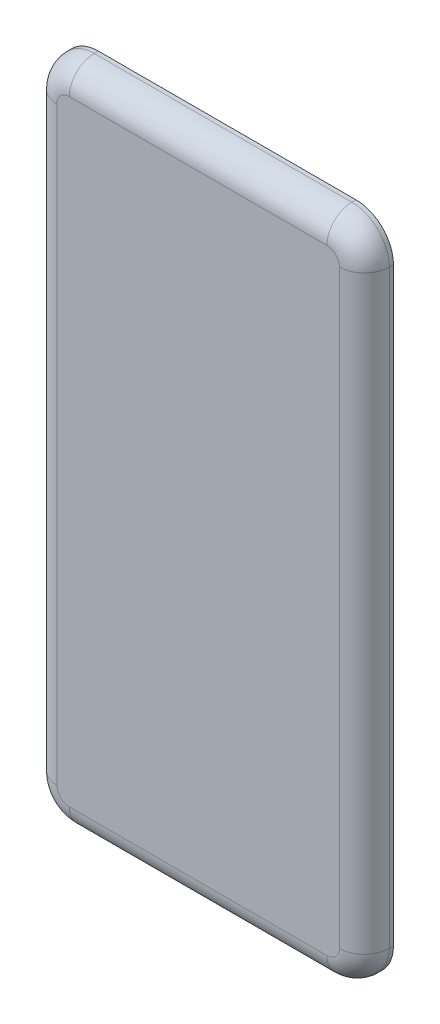
ISO-10303-21;
HEADER;
FILE_DESCRIPTION(('STEP AP214'),'2;1');
FILE_NAME('part.step','',(''),(''),'','','');
FILE_SCHEMA(('AUTOMOTIVE_DESIGN { 1 0 10303 214 1 1 1 1 }'));
ENDSEC;
DATA;
#1=APPLICATION_CONTEXT('core data for automotive mechanical design processes');
#2=APPLICATION_PROTOCOL_DEFINITION('international standard','automotive_design',2000,#1);
#3=PRODUCT_CONTEXT('',#1,'mechanical');
#4=PRODUCT('Part','Part','',(#3));
#5=PRODUCT_RELATED_PRODUCT_CATEGORY('part','',(#4));
#6=PRODUCT_DEFINITION_FORMATION('','',#4);
#7=PRODUCT_DEFINITION_CONTEXT('part definition',#1,'design');
#8=PRODUCT_DEFINITION('design','',#6,#7);
#9=PRODUCT_DEFINITION_SHAPE('','',#8);
#10=(LENGTH_UNIT() NAMED_UNIT(*) SI_UNIT(.MILLI.,.METRE.));
#11=(NAMED_UNIT(*) PLANE_ANGLE_UNIT() SI_UNIT($,.RADIAN.));
#12=(NAMED_UNIT(*) SI_UNIT($,.STERADIAN.) SOLID_ANGLE_UNIT());
#13=UNCERTAINTY_MEASURE_WITH_UNIT(LENGTH_MEASURE(1.E-05),#10,'distance_accuracy_value','');
#14=(GEOMETRIC_REPRESENTATION_CONTEXT(3) GLOBAL_UNCERTAINTY_ASSIGNED_CONTEXT((#13)) GLOBAL_UNIT_ASSIGNED_CONTEXT((#10,
#11,#12)) REPRESENTATION_CONTEXT('',''));
#15=CARTESIAN_POINT('',(0.,0.,0.));
#16=DIRECTION('',(0.,0.,1.));
#17=DIRECTION('',(1.,0.,0.));
#18=AXIS2_PLACEMENT_3D('',#15,#16,#17);
#19=CARTESIAN_POINT('',(88.1928839875572,0.,3.5));
#20=DIRECTION('',(0.,1.,0.));
#21=DIRECTION('',(0.,0.,1.));
#22=AXIS2_PLACEMENT_3D('',#19,#20,#21);
#23=PLANE('',#22);
#24=DIRECTION('',(0.,0.,-1.));
#25=VECTOR('',#24,1.);
#26=CARTESIAN_POINT('',(83.6928839875572,0.,3.5));
#27=LINE('',#26,#25);
#28=CARTESIAN_POINT('',(83.6928839875572,0.,0.));
#29=VERTEX_POINT('',#28);
#30=CARTESIAN_POINT('',(83.6928839875572,0.,0.5));
#31=VERTEX_POINT('',#30);
#32=EDGE_CURVE('E145',#29,#31,#27,.F.);
#33=ORIENTED_EDGE('',*,*,#32,.T.);
#34=DIRECTION('',(1.,0.,0.));
#35=VECTOR('',#34,1.);
#36=CARTESIAN_POINT('',(88.1928839875572,0.,0.5));
#37=LINE('',#36,#35);
#38=CARTESIAN_POINT('',(52.6928839875572,0.,0.5));
#39=VERTEX_POINT('',#38);
#40=EDGE_CURVE('E72',#31,#39,#37,.F.);
#41=ORIENTED_EDGE('',*,*,#40,.T.);
#42=DIRECTION('',(0.,0.,-1.));
#43=VECTOR('',#42,1.);
#44=CARTESIAN_POINT('',(52.6928839875572,0.,3.5));
#45=LINE('',#44,#43);
#46=CARTESIAN_POINT('',(52.6928839875572,0.,0.));
#47=VERTEX_POINT('',#46);
#48=EDGE_CURVE('E137',#39,#47,#45,.T.);
#49=ORIENTED_EDGE('',*,*,#48,.T.);
#50=DIRECTION('',(1.,0.,0.));
#51=VECTOR('',#50,1.);
#52=CARTESIAN_POINT('',(88.1928839875572,0.,0.));
#53=LINE('',#52,#51);
#54=EDGE_CURVE('E140',#47,#29,#53,.T.);
#55=ORIENTED_EDGE('',*,*,#54,.T.);
#56=EDGE_LOOP('',(#33,#41,#49,#55));
#57=FACE_BOUND('',#56,.T.);
#58=ADVANCED_FACE('F47',(#57),#23,.F.);
#59=CARTESIAN_POINT('',(88.1928839875572,80.,3.5));
#60=DIRECTION('',(-1.,0.,0.));
#61=DIRECTION('',(0.,0.,1.));
#62=AXIS2_PLACEMENT_3D('',#59,#60,#61);
#63=PLANE('',#62);
#64=DIRECTION('',(0.,0.,-1.));
#65=VECTOR('',#64,1.);
#66=CARTESIAN_POINT('',(88.1928839875572,75.5,3.5));
#67=LINE('',#66,#65);
#68=CARTESIAN_POINT('',(88.1928839875572,75.5,0.));
#69=VERTEX_POINT('',#68);
#70=CARTESIAN_POINT('',(88.1928839875572,75.5,0.5));
#71=VERTEX_POINT('',#70);
#72=EDGE_CURVE('E190',#69,#71,#67,.F.);
#73=ORIENTED_EDGE('',*,*,#72,.T.);
#74=DIRECTION('',(0.,1.,0.));
#75=VECTOR('',#74,1.);
#76=CARTESIAN_POINT('',(88.1928839875572,80.,0.5));
#77=LINE('',#76,#75);
#78=CARTESIAN_POINT('',(88.1928839875572,4.5,0.5));
#79=VERTEX_POINT('',#78);
#80=EDGE_CURVE('E239',#71,#79,#77,.F.);
#81=ORIENTED_EDGE('',*,*,#80,.T.);
#82=DIRECTION('',(0.,0.,-1.));
#83=VECTOR('',#82,1.);
#84=CARTESIAN_POINT('',(88.1928839875572,4.5,3.5));
#85=LINE('',#84,#83);
#86=CARTESIAN_POINT('',(88.1928839875572,4.5,0.));
#87=VERTEX_POINT('',#86);
#88=EDGE_CURVE('E194',#79,#87,#85,.T.);
#89=ORIENTED_EDGE('',*,*,#88,.T.);
#90=DIRECTION('',(0.,1.,0.));
#91=VECTOR('',#90,1.);
#92=CARTESIAN_POINT('',(88.1928839875572,80.,0.));
#93=LINE('',#92,#91);
#94=EDGE_CURVE('E161',#87,#69,#93,.T.);
#95=ORIENTED_EDGE('',*,*,#94,.T.);
#96=EDGE_LOOP('',(#73,#81,#89,#95));
#97=FACE_BOUND('',#96,.T.);
#98=ADVANCED_FACE('F327',(#97),#63,.F.);
#99=CARTESIAN_POINT('',(48.1928839875572,80.,3.5));
#100=DIRECTION('',(0.,-1.,0.));
#101=DIRECTION('',(0.,0.,-1.));
#102=AXIS2_PLACEMENT_3D('',#99,#100,#101);
#103=PLANE('',#102);
#104=DIRECTION('',(0.,0.,-1.));
#105=VECTOR('',#104,1.);
#106=CARTESIAN_POINT('',(52.6928839875572,80.,3.5));
#107=LINE('',#106,#105);
#108=CARTESIAN_POINT('',(52.6928839875572,80.,0.));
#109=VERTEX_POINT('',#108);
#110=CARTESIAN_POINT('',(52.6928839875572,80.,0.5));
#111=VERTEX_POINT('',#110);
#112=EDGE_CURVE('E200',#109,#111,#107,.F.);
#113=ORIENTED_EDGE('',*,*,#112,.T.);
#114=DIRECTION('',(-1.,0.,0.));
#115=VECTOR('',#114,1.);
#116=CARTESIAN_POINT('',(48.1928839875572,80.,0.5));
#117=LINE('',#116,#115);
#118=CARTESIAN_POINT('',(83.6928839875572,80.,0.5));
#119=VERTEX_POINT('',#118);
#120=EDGE_CURVE('E233',#111,#119,#117,.F.);
#121=ORIENTED_EDGE('',*,*,#120,.T.);
#122=DIRECTION('',(0.,0.,-1.));
#123=VECTOR('',#122,1.);
#124=CARTESIAN_POINT('',(83.6928839875572,80.,3.5));
#125=LINE('',#124,#123);
#126=CARTESIAN_POINT('',(83.6928839875572,80.,0.));
#127=VERTEX_POINT('',#126);
#128=EDGE_CURVE('E197',#119,#127,#125,.T.);
#129=ORIENTED_EDGE('',*,*,#128,.T.);
#130=DIRECTION('',(-1.,0.,0.));
#131=VECTOR('',#130,1.);
#132=CARTESIAN_POINT('',(48.1928839875572,80.,0.));
#133=LINE('',#132,#131);
#134=EDGE_CURVE('E166',#127,#109,#133,.T.);
#135=ORIENTED_EDGE('',*,*,#134,.T.);
#136=EDGE_LOOP('',(#113,#121,#129,#135));
#137=FACE_BOUND('',#136,.T.);
#138=ADVANCED_FACE('F312',(#137),#103,.F.);
#139=CARTESIAN_POINT('',(48.1928839875572,0.,3.5));
#140=DIRECTION('',(1.,0.,0.));
#141=DIRECTION('',(0.,0.,-1.));
#142=AXIS2_PLACEMENT_3D('',#139,#140,#141);
#143=PLANE('',#142);
#144=DIRECTION('',(0.,0.,-1.));
#145=VECTOR('',#144,1.);
#146=CARTESIAN_POINT('',(48.1928839875572,4.5,3.5));
#147=LINE('',#146,#145);
#148=CARTESIAN_POINT('',(48.1928839875572,4.5,0.));
#149=VERTEX_POINT('',#148);
#150=CARTESIAN_POINT('',(48.1928839875572,4.5,0.5));
#151=VERTEX_POINT('',#150);
#152=EDGE_CURVE('E149',#149,#151,#147,.F.);
#153=ORIENTED_EDGE('',*,*,#152,.T.);
#154=DIRECTION('',(0.,-1.,0.));
#155=VECTOR('',#154,1.);
#156=CARTESIAN_POINT('',(48.1928839875572,0.,0.5));
#157=LINE('',#156,#155);
#158=CARTESIAN_POINT('',(48.1928839875572,75.5,0.5));
#159=VERTEX_POINT('',#158);
#160=EDGE_CURVE('E11',#151,#159,#157,.F.);
#161=ORIENTED_EDGE('',*,*,#160,.T.);
#162=DIRECTION('',(0.,0.,-1.));
#163=VECTOR('',#162,1.);
#164=CARTESIAN_POINT('',(48.1928839875572,75.5,3.5));
#165=LINE('',#164,#163);
#166=CARTESIAN_POINT('',(48.1928839875572,75.5,0.));
#167=VERTEX_POINT('',#166);
#168=EDGE_CURVE('E154',#159,#167,#165,.T.);
#169=ORIENTED_EDGE('',*,*,#168,.T.);
#170=DIRECTION('',(0.,-1.,0.));
#171=VECTOR('',#170,1.);
#172=CARTESIAN_POINT('',(48.1928839875572,0.,0.));
#173=LINE('',#172,#171);
#174=EDGE_CURVE('E174',#167,#149,#173,.T.);
#175=ORIENTED_EDGE('',*,*,#174,.T.);
#176=EDGE_LOOP('',(#153,#161,#169,#175));
#177=FACE_BOUND('',#176,.T.);
#178=ADVANCED_FACE('F295',(#177),#143,.F.);
#179=CARTESIAN_POINT('',(0.,0.,3.5));
#180=DIRECTION('',(0.,0.,-1.));
#181=DIRECTION('',(-1.,0.,0.));
#182=AXIS2_PLACEMENT_3D('',#179,#180,#181);
#183=PLANE('',#182);
#184=DIRECTION('',(-1.,0.,0.));
#185=VECTOR('',#184,1.);
#186=CARTESIAN_POINT('',(0.,77.,3.5));
#187=LINE('',#186,#185);
#188=CARTESIAN_POINT('',(83.6928839875572,77.,3.5));
#189=VERTEX_POINT('',#188);
#190=CARTESIAN_POINT('',(52.6928839875572,77.,3.5));
#191=VERTEX_POINT('',#190);
#192=EDGE_CURVE('E222',#189,#191,#187,.T.);
#193=ORIENTED_EDGE('',*,*,#192,.T.);
#194=CARTESIAN_POINT('',(52.6928839875572,75.5,3.5));
#195=DIRECTION('',(0.,0.,-1.));
#196=DIRECTION('',(-1.,0.,0.));
#197=AXIS2_PLACEMENT_3D('',#194,#195,#196);
#198=CIRCLE('',#197,1.5);
#199=CARTESIAN_POINT('',(51.1928839875572,75.5,3.5));
#200=VERTEX_POINT('',#199);
#201=EDGE_CURVE('E225',#191,#200,#198,.F.);
#202=ORIENTED_EDGE('',*,*,#201,.T.);
#203=DIRECTION('',(0.,-1.,0.));
#204=VECTOR('',#203,1.);
#205=CARTESIAN_POINT('',(51.1928839875572,0.,3.5));
#206=LINE('',#205,#204);
#207=CARTESIAN_POINT('',(51.1928839875572,4.5,3.5));
#208=VERTEX_POINT('',#207);
#209=EDGE_CURVE('E204',#200,#208,#206,.T.);
#210=ORIENTED_EDGE('',*,*,#209,.T.);
#211=CARTESIAN_POINT('',(52.6928839875572,4.5,3.5));
#212=DIRECTION('',(0.,0.,-1.));
#213=DIRECTION('',(-1.,0.,0.));
#214=AXIS2_PLACEMENT_3D('',#211,#212,#213);
#215=CIRCLE('',#214,1.5);
#216=CARTESIAN_POINT('',(52.6928839875572,3.,3.5));
#217=VERTEX_POINT('',#216);
#218=EDGE_CURVE('E207',#208,#217,#215,.F.);
#219=ORIENTED_EDGE('',*,*,#218,.T.);
#220=DIRECTION('',(1.,0.,0.));
#221=VECTOR('',#220,1.);
#222=CARTESIAN_POINT('',(0.,3.,3.5));
#223=LINE('',#222,#221);
#224=CARTESIAN_POINT('',(83.6928839875572,3.,3.5));
#225=VERTEX_POINT('',#224);
#226=EDGE_CURVE('E210',#217,#225,#223,.T.);
#227=ORIENTED_EDGE('',*,*,#226,.T.);
#228=CARTESIAN_POINT('',(83.6928839875572,4.5,3.5));
#229=DIRECTION('',(0.,0.,-1.));
#230=DIRECTION('',(-1.,0.,0.));
#231=AXIS2_PLACEMENT_3D('',#228,#229,#230);
#232=CIRCLE('',#231,1.5);
#233=CARTESIAN_POINT('',(85.1928839875572,4.5,3.5));
#234=VERTEX_POINT('',#233);
#235=EDGE_CURVE('E213',#225,#234,#232,.F.);
#236=ORIENTED_EDGE('',*,*,#235,.T.);
#237=DIRECTION('',(0.,1.,0.));
#238=VECTOR('',#237,1.);
#239=CARTESIAN_POINT('',(85.1928839875572,0.,3.5));
#240=LINE('',#239,#238);
#241=CARTESIAN_POINT('',(85.1928839875572,75.5,3.5));
#242=VERTEX_POINT('',#241);
#243=EDGE_CURVE('E216',#234,#242,#240,.T.);
#244=ORIENTED_EDGE('',*,*,#243,.T.);
#245=CARTESIAN_POINT('',(83.6928839875572,75.5,3.5));
#246=DIRECTION('',(0.,0.,-1.));
#247=DIRECTION('',(-1.,0.,0.));
#248=AXIS2_PLACEMENT_3D('',#245,#246,#247);
#249=CIRCLE('',#248,1.5);
#250=EDGE_CURVE('E219',#242,#189,#249,.F.);
#251=ORIENTED_EDGE('',*,*,#250,.T.);
#252=EDGE_LOOP('',(#193,#202,#210,#219,#227,#236,#244,#251));
#253=FACE_BOUND('',#252,.T.);
#254=ADVANCED_FACE('F282',(#253),#183,.F.);
#255=CARTESIAN_POINT('',(0.,0.,0.));
#256=DIRECTION('',(0.,0.,-1.));
#257=DIRECTION('',(-1.,0.,0.));
#258=AXIS2_PLACEMENT_3D('',#255,#256,#257);
#259=PLANE('',#258);
#260=ORIENTED_EDGE('',*,*,#54,.F.);
#261=CARTESIAN_POINT('',(52.6928839875572,4.5,0.));
#262=DIRECTION('',(0.,0.,-1.));
#263=DIRECTION('',(-1.,0.,0.));
#264=AXIS2_PLACEMENT_3D('',#261,#262,#263);
#265=CIRCLE('',#264,4.5);
#266=EDGE_CURVE('E147',#47,#149,#265,.T.);
#267=ORIENTED_EDGE('',*,*,#266,.T.);
#268=ORIENTED_EDGE('',*,*,#174,.F.);
#269=CARTESIAN_POINT('',(52.6928839875572,75.5,0.));
#270=DIRECTION('',(0.,0.,-1.));
#271=DIRECTION('',(-1.,0.,0.));
#272=AXIS2_PLACEMENT_3D('',#269,#270,#271);
#273=CIRCLE('',#272,4.5);
#274=EDGE_CURVE('E181',#167,#109,#273,.T.);
#275=ORIENTED_EDGE('',*,*,#274,.T.);
#276=ORIENTED_EDGE('',*,*,#134,.F.);
#277=CARTESIAN_POINT('',(83.6928839875572,75.5,0.));
#278=DIRECTION('',(0.,0.,-1.));
#279=DIRECTION('',(-1.,0.,0.));
#280=AXIS2_PLACEMENT_3D('',#277,#278,#279);
#281=CIRCLE('',#280,4.5);
#282=EDGE_CURVE('E144',#127,#69,#281,.T.);
#283=ORIENTED_EDGE('',*,*,#282,.T.);
#284=ORIENTED_EDGE('',*,*,#94,.F.);
#285=CARTESIAN_POINT('',(83.6928839875572,4.5,0.));
#286=DIRECTION('',(0.,0.,-1.));
#287=DIRECTION('',(-1.,0.,0.));
#288=AXIS2_PLACEMENT_3D('',#285,#286,#287);
#289=CIRCLE('',#288,4.5);
#290=EDGE_CURVE('E155',#87,#29,#289,.T.);
#291=ORIENTED_EDGE('',*,*,#290,.T.);
#292=EDGE_LOOP('',(#260,#267,#268,#275,#276,#283,#284,#291));
#293=FACE_BOUND('',#292,.T.);
#294=ADVANCED_FACE('F157',(#293),#259,.T.);
#295=CARTESIAN_POINT('',(52.6928839875572,4.5,3.5));
#296=DIRECTION('',(0.,0.,-1.));
#297=DIRECTION('',(-1.,0.,0.));
#298=AXIS2_PLACEMENT_3D('',#295,#296,#297);
#299=CYLINDRICAL_SURFACE('',#298,4.5);
#300=ORIENTED_EDGE('',*,*,#48,.F.);
#301=CARTESIAN_POINT('',(52.6928839875572,4.5,0.5));
#302=DIRECTION('',(0.,0.,-1.));
#303=DIRECTION('',(-1.,0.,0.));
#304=AXIS2_PLACEMENT_3D('',#301,#302,#303);
#305=CIRCLE('',#304,4.5);
#306=EDGE_CURVE('E57',#39,#151,#305,.T.);
#307=ORIENTED_EDGE('',*,*,#306,.T.);
#308=ORIENTED_EDGE('',*,*,#152,.F.);
#309=ORIENTED_EDGE('',*,*,#266,.F.);
#310=EDGE_LOOP('',(#300,#307,#308,#309));
#311=FACE_BOUND('',#310,.T.);
#312=ADVANCED_FACE('F148',(#311),#299,.T.);
#313=CARTESIAN_POINT('',(83.6928839875572,4.5,3.5));
#314=DIRECTION('',(0.,0.,-1.));
#315=DIRECTION('',(-1.,0.,0.));
#316=AXIS2_PLACEMENT_3D('',#313,#314,#315);
#317=CYLINDRICAL_SURFACE('',#316,4.5);
#318=ORIENTED_EDGE('',*,*,#88,.F.);
#319=CARTESIAN_POINT('',(83.6928839875572,4.5,0.5));
#320=DIRECTION('',(0.,0.,-1.));
#321=DIRECTION('',(-1.,0.,0.));
#322=AXIS2_PLACEMENT_3D('',#319,#320,#321);
#323=CIRCLE('',#322,4.5);
#324=EDGE_CURVE('E242',#79,#31,#323,.T.);
#325=ORIENTED_EDGE('',*,*,#324,.T.);
#326=ORIENTED_EDGE('',*,*,#32,.F.);
#327=ORIENTED_EDGE('',*,*,#290,.F.);
#328=EDGE_LOOP('',(#318,#325,#326,#327));
#329=FACE_BOUND('',#328,.T.);
#330=ADVANCED_FACE('F329',(#329),#317,.T.);
#331=CARTESIAN_POINT('',(52.6928839875572,75.5,3.5));
#332=DIRECTION('',(0.,0.,-1.));
#333=DIRECTION('',(-1.,0.,0.));
#334=AXIS2_PLACEMENT_3D('',#331,#332,#333);
#335=CYLINDRICAL_SURFACE('',#334,4.5);
#336=ORIENTED_EDGE('',*,*,#168,.F.);
#337=CARTESIAN_POINT('',(52.6928839875572,75.5,0.5));
#338=DIRECTION('',(0.,0.,-1.));
#339=DIRECTION('',(-1.,0.,0.));
#340=AXIS2_PLACEMENT_3D('',#337,#338,#339);
#341=CIRCLE('',#340,4.5);
#342=EDGE_CURVE('E229',#159,#111,#341,.T.);
#343=ORIENTED_EDGE('',*,*,#342,.T.);
#344=ORIENTED_EDGE('',*,*,#112,.F.);
#345=ORIENTED_EDGE('',*,*,#274,.F.);
#346=EDGE_LOOP('',(#336,#343,#344,#345));
#347=FACE_BOUND('',#346,.T.);
#348=ADVANCED_FACE('F299',(#347),#335,.T.);
#349=CARTESIAN_POINT('',(83.6928839875572,75.5,3.5));
#350=DIRECTION('',(0.,0.,-1.));
#351=DIRECTION('',(-1.,0.,0.));
#352=AXIS2_PLACEMENT_3D('',#349,#350,#351);
#353=CYLINDRICAL_SURFACE('',#352,4.5);
#354=ORIENTED_EDGE('',*,*,#128,.F.);
#355=CARTESIAN_POINT('',(83.6928839875572,75.5,0.5));
#356=DIRECTION('',(0.,0.,-1.));
#357=DIRECTION('',(-1.,0.,0.));
#358=AXIS2_PLACEMENT_3D('',#355,#356,#357);
#359=CIRCLE('',#358,4.5);
#360=EDGE_CURVE('E236',#119,#71,#359,.T.);
#361=ORIENTED_EDGE('',*,*,#360,.T.);
#362=ORIENTED_EDGE('',*,*,#72,.F.);
#363=ORIENTED_EDGE('',*,*,#282,.F.);
#364=EDGE_LOOP('',(#354,#361,#362,#363));
#365=FACE_BOUND('',#364,.T.);
#366=ADVANCED_FACE('F316',(#365),#353,.T.);
#367=CARTESIAN_POINT('',(83.6928839875572,4.5,0.5));
#368=DIRECTION('',(0.,0.,-1.));
#369=DIRECTION('',(-1.,0.,0.));
#370=AXIS2_PLACEMENT_3D('',#367,#368,#369);
#371=DEGENERATE_TOROIDAL_SURFACE('',#370,1.5,3.,.T.);
#372=CARTESIAN_POINT('',(83.6928839875572,3.,0.5));
#373=DIRECTION('',(-1.,0.,0.));
#374=DIRECTION('',(0.,0.,1.));
#375=AXIS2_PLACEMENT_3D('',#372,#373,#374);
#376=CIRCLE('',#375,3.);
#377=EDGE_CURVE('E169',#31,#225,#376,.T.);
#378=ORIENTED_EDGE('',*,*,#377,.F.);
#379=ORIENTED_EDGE('',*,*,#324,.F.);
#380=CARTESIAN_POINT('',(85.1928839875572,4.5,0.5));
#381=DIRECTION('',(0.,1.,0.));
#382=DIRECTION('',(0.,0.,1.));
#383=AXIS2_PLACEMENT_3D('',#380,#381,#382);
#384=CIRCLE('',#383,3.);
#385=EDGE_CURVE('E51',#234,#79,#384,.T.);
#386=ORIENTED_EDGE('',*,*,#385,.F.);
#387=ORIENTED_EDGE('',*,*,#235,.F.);
#388=EDGE_LOOP('',(#378,#379,#386,#387));
#389=FACE_BOUND('',#388,.T.);
#390=ADVANCED_FACE('F49',(#389),#371,.T.);
#391=CARTESIAN_POINT('',(85.1928839875572,0.,0.5));
#392=DIRECTION('',(0.,1.,0.));
#393=DIRECTION('',(0.,0.,1.));
#394=AXIS2_PLACEMENT_3D('',#391,#392,#393);
#395=CYLINDRICAL_SURFACE('',#394,3.);
#396=ORIENTED_EDGE('',*,*,#385,.T.);
#397=ORIENTED_EDGE('',*,*,#80,.F.);
#398=CARTESIAN_POINT('',(85.1928839875572,75.5,0.5));
#399=DIRECTION('',(0.,1.,0.));
#400=DIRECTION('',(0.,0.,1.));
#401=AXIS2_PLACEMENT_3D('',#398,#399,#400);
#402=CIRCLE('',#401,3.);
#403=EDGE_CURVE('E267',#242,#71,#402,.T.);
#404=ORIENTED_EDGE('',*,*,#403,.F.);
#405=ORIENTED_EDGE('',*,*,#243,.F.);
#406=EDGE_LOOP('',(#396,#397,#404,#405));
#407=FACE_BOUND('',#406,.T.);
#408=ADVANCED_FACE('F324',(#407),#395,.T.);
#409=CARTESIAN_POINT('',(0.,3.,0.5));
#410=DIRECTION('',(1.,0.,0.));
#411=DIRECTION('',(0.,0.,-1.));
#412=AXIS2_PLACEMENT_3D('',#409,#410,#411);
#413=CYLINDRICAL_SURFACE('',#412,3.);
#414=ORIENTED_EDGE('',*,*,#377,.T.);
#415=ORIENTED_EDGE('',*,*,#226,.F.);
#416=CARTESIAN_POINT('',(52.6928839875572,3.,0.5));
#417=DIRECTION('',(-1.,0.,0.));
#418=DIRECTION('',(0.,0.,1.));
#419=AXIS2_PLACEMENT_3D('',#416,#417,#418);
#420=CIRCLE('',#419,3.);
#421=EDGE_CURVE('E263',#39,#217,#420,.T.);
#422=ORIENTED_EDGE('',*,*,#421,.F.);
#423=ORIENTED_EDGE('',*,*,#40,.F.);
#424=EDGE_LOOP('',(#414,#415,#422,#423));
#425=FACE_BOUND('',#424,.T.);
#426=ADVANCED_FACE('F275',(#425),#413,.T.);
#427=CARTESIAN_POINT('',(83.6928839875572,75.5,0.5));
#428=DIRECTION('',(0.,0.,-1.));
#429=DIRECTION('',(-1.,0.,0.));
#430=AXIS2_PLACEMENT_3D('',#427,#428,#429);
#431=DEGENERATE_TOROIDAL_SURFACE('',#430,1.5,3.,.T.);
#432=ORIENTED_EDGE('',*,*,#403,.T.);
#433=ORIENTED_EDGE('',*,*,#360,.F.);
#434=CARTESIAN_POINT('',(83.6928839875572,77.,0.5));
#435=DIRECTION('',(-1.,0.,0.));
#436=DIRECTION('',(0.,0.,1.));
#437=AXIS2_PLACEMENT_3D('',#434,#435,#436);
#438=CIRCLE('',#437,3.);
#439=EDGE_CURVE('E259',#189,#119,#438,.T.);
#440=ORIENTED_EDGE('',*,*,#439,.F.);
#441=ORIENTED_EDGE('',*,*,#250,.F.);
#442=EDGE_LOOP('',(#432,#433,#440,#441));
#443=FACE_BOUND('',#442,.T.);
#444=ADVANCED_FACE('F320',(#443),#431,.T.);
#445=CARTESIAN_POINT('',(52.6928839875572,4.5,0.5));
#446=DIRECTION('',(0.,0.,-1.));
#447=DIRECTION('',(-1.,0.,0.));
#448=AXIS2_PLACEMENT_3D('',#445,#446,#447);
#449=DEGENERATE_TOROIDAL_SURFACE('',#448,1.5,3.,.T.);
#450=ORIENTED_EDGE('',*,*,#421,.T.);
#451=ORIENTED_EDGE('',*,*,#218,.F.);
#452=CARTESIAN_POINT('',(51.1928839875572,4.5,0.5));
#453=DIRECTION('',(0.,1.,0.));
#454=DIRECTION('',(0.,0.,1.));
#455=AXIS2_PLACEMENT_3D('',#452,#453,#454);
#456=CIRCLE('',#455,3.);
#457=EDGE_CURVE('E255',#151,#208,#456,.T.);
#458=ORIENTED_EDGE('',*,*,#457,.F.);
#459=ORIENTED_EDGE('',*,*,#306,.F.);
#460=EDGE_LOOP('',(#450,#451,#458,#459));
#461=FACE_BOUND('',#460,.T.);
#462=ADVANCED_FACE('F288',(#461),#449,.T.);
#463=CARTESIAN_POINT('',(0.,77.,0.5));
#464=DIRECTION('',(-1.,0.,0.));
#465=DIRECTION('',(0.,0.,1.));
#466=AXIS2_PLACEMENT_3D('',#463,#464,#465);
#467=CYLINDRICAL_SURFACE('',#466,3.);
#468=ORIENTED_EDGE('',*,*,#439,.T.);
#469=ORIENTED_EDGE('',*,*,#120,.F.);
#470=CARTESIAN_POINT('',(52.6928839875572,77.,0.5));
#471=DIRECTION('',(-1.,0.,0.));
#472=DIRECTION('',(0.,0.,1.));
#473=AXIS2_PLACEMENT_3D('',#470,#471,#472);
#474=CIRCLE('',#473,3.);
#475=EDGE_CURVE('E252',#191,#111,#474,.T.);
#476=ORIENTED_EDGE('',*,*,#475,.F.);
#477=ORIENTED_EDGE('',*,*,#192,.F.);
#478=EDGE_LOOP('',(#468,#469,#476,#477));
#479=FACE_BOUND('',#478,.T.);
#480=ADVANCED_FACE('F308',(#479),#467,.T.);
#481=CARTESIAN_POINT('',(51.1928839875572,0.,0.5));
#482=DIRECTION('',(0.,-1.,0.));
#483=DIRECTION('',(0.,0.,-1.));
#484=AXIS2_PLACEMENT_3D('',#481,#482,#483);
#485=CYLINDRICAL_SURFACE('',#484,3.);
#486=ORIENTED_EDGE('',*,*,#457,.T.);
#487=ORIENTED_EDGE('',*,*,#209,.F.);
#488=CARTESIAN_POINT('',(51.1928839875572,75.5,0.5));
#489=DIRECTION('',(0.,1.,0.));
#490=DIRECTION('',(0.,0.,1.));
#491=AXIS2_PLACEMENT_3D('',#488,#489,#490);
#492=CIRCLE('',#491,3.);
#493=EDGE_CURVE('E249',#159,#200,#492,.T.);
#494=ORIENTED_EDGE('',*,*,#493,.F.);
#495=ORIENTED_EDGE('',*,*,#160,.F.);
#496=EDGE_LOOP('',(#486,#487,#494,#495));
#497=FACE_BOUND('',#496,.T.);
#498=ADVANCED_FACE('F291',(#497),#485,.T.);
#499=CARTESIAN_POINT('',(52.6928839875572,75.5,0.5));
#500=DIRECTION('',(0.,0.,-1.));
#501=DIRECTION('',(-1.,0.,0.));
#502=AXIS2_PLACEMENT_3D('',#499,#500,#501);
#503=DEGENERATE_TOROIDAL_SURFACE('',#502,1.5,3.,.T.);
#504=ORIENTED_EDGE('',*,*,#475,.T.);
#505=ORIENTED_EDGE('',*,*,#342,.F.);
#506=ORIENTED_EDGE('',*,*,#493,.T.);
#507=ORIENTED_EDGE('',*,*,#201,.F.);
#508=EDGE_LOOP('',(#504,#505,#506,#507));
#509=FACE_BOUND('',#508,.T.);
#510=ADVANCED_FACE('F302',(#509),#503,.T.);
#511=CLOSED_SHELL('',(#58,#98,#138,#178,#254,#294,#312,#330,#348,#366,#390,#408,#426,#444,#462,
#480,#498,#510));
#512=MANIFOLD_SOLID_BREP('B2',#511);
#513=ADVANCED_BREP_SHAPE_REPRESENTATION('',(#18,#512),#14);
#514=SHAPE_DEFINITION_REPRESENTATION(#9,#513);
ENDSEC;
END-ISO-10303-21;
